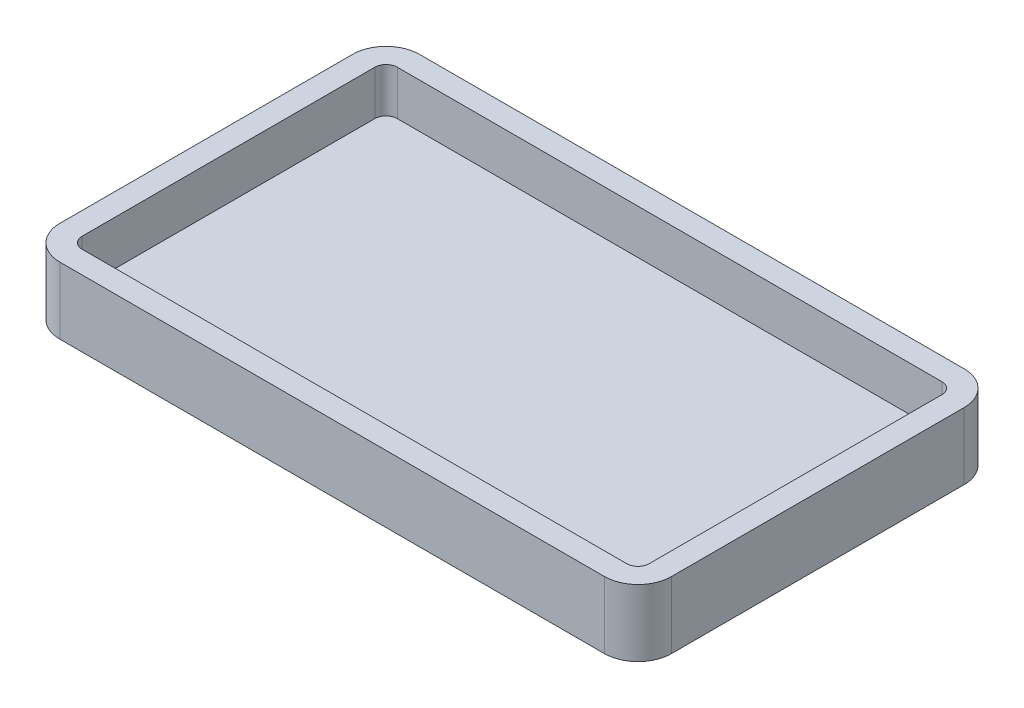
ISO-10303-21;
HEADER;
FILE_DESCRIPTION(('STEP AP214'),'2;1');
FILE_NAME('part.step','',(''),(''),'','','');
FILE_SCHEMA(('AUTOMOTIVE_DESIGN { 1 0 10303 214 1 1 1 1 }'));
ENDSEC;
DATA;
#1=APPLICATION_CONTEXT('core data for automotive mechanical design processes');
#2=APPLICATION_PROTOCOL_DEFINITION('international standard','automotive_design',2000,#1);
#3=PRODUCT_CONTEXT('',#1,'mechanical');
#4=PRODUCT('Part','Part','',(#3));
#5=PRODUCT_RELATED_PRODUCT_CATEGORY('part','',(#4));
#6=PRODUCT_DEFINITION_FORMATION('','',#4);
#7=PRODUCT_DEFINITION_CONTEXT('part definition',#1,'design');
#8=PRODUCT_DEFINITION('design','',#6,#7);
#9=PRODUCT_DEFINITION_SHAPE('','',#8);
#10=(LENGTH_UNIT() NAMED_UNIT(*) SI_UNIT(.MILLI.,.METRE.));
#11=(NAMED_UNIT(*) PLANE_ANGLE_UNIT() SI_UNIT($,.RADIAN.));
#12=(NAMED_UNIT(*) SI_UNIT($,.STERADIAN.) SOLID_ANGLE_UNIT());
#13=UNCERTAINTY_MEASURE_WITH_UNIT(LENGTH_MEASURE(1.E-05),#10,'distance_accuracy_value','');
#14=(GEOMETRIC_REPRESENTATION_CONTEXT(3) GLOBAL_UNCERTAINTY_ASSIGNED_CONTEXT((#13)) GLOBAL_UNIT_ASSIGNED_CONTEXT((#10,
#11,#12)) REPRESENTATION_CONTEXT('',''));
#15=CARTESIAN_POINT('',(0.,0.,0.));
#16=DIRECTION('',(0.,0.,1.));
#17=DIRECTION('',(1.,0.,0.));
#18=AXIS2_PLACEMENT_3D('',#15,#16,#17);
#19=CARTESIAN_POINT('',(4.7752,-9.525,-46.5409330049261));
#20=DIRECTION('',(0.,1.,0.));
#21=DIRECTION('',(0.,0.,1.));
#22=AXIS2_PLACEMENT_3D('',#19,#20,#21);
#23=CYLINDRICAL_SURFACE('',#22,4.7752);
#24=CARTESIAN_POINT('',(4.7752,0.,-46.5409330049261));
#25=DIRECTION('',(0.,1.,0.));
#26=DIRECTION('',(0.,0.,1.));
#27=AXIS2_PLACEMENT_3D('',#24,#25,#26);
#28=CIRCLE('',#27,4.7752);
#29=CARTESIAN_POINT('',(4.77520000000003,0.,-51.3161330049261));
#30=VERTEX_POINT('',#29);
#31=CARTESIAN_POINT('',(0.,0.,-46.5409330049261));
#32=VERTEX_POINT('',#31);
#33=EDGE_CURVE('E141',#30,#32,#28,.T.);
#34=ORIENTED_EDGE('',*,*,#33,.F.);
#35=DIRECTION('',(0.,1.,0.));
#36=VECTOR('',#35,1.);
#37=CARTESIAN_POINT('',(4.77520000000003,-9.525,-51.3161330049261));
#38=LINE('',#37,#36);
#39=CARTESIAN_POINT('',(4.77520000000003,-9.525,-51.3161330049261));
#40=VERTEX_POINT('',#39);
#41=EDGE_CURVE('E11',#40,#30,#38,.T.);
#42=ORIENTED_EDGE('',*,*,#41,.F.);
#43=CARTESIAN_POINT('',(4.7752,-9.525,-46.5409330049261));
#44=DIRECTION('',(0.,1.,0.));
#45=DIRECTION('',(0.,0.,1.));
#46=AXIS2_PLACEMENT_3D('',#43,#44,#45);
#47=CIRCLE('',#46,4.7752);
#48=CARTESIAN_POINT('',(0.,-9.525,-46.5409330049261));
#49=VERTEX_POINT('',#48);
#50=EDGE_CURVE('E162',#40,#49,#47,.T.);
#51=ORIENTED_EDGE('',*,*,#50,.T.);
#52=DIRECTION('',(0.,1.,0.));
#53=VECTOR('',#52,1.);
#54=CARTESIAN_POINT('',(0.,-9.525,-46.5409330049261));
#55=LINE('',#54,#53);
#56=EDGE_CURVE('E34',#49,#32,#55,.T.);
#57=ORIENTED_EDGE('',*,*,#56,.T.);
#58=EDGE_LOOP('',(#34,#42,#51,#57));
#59=FACE_BOUND('',#58,.T.);
#60=ADVANCED_FACE('F31',(#59),#23,.T.);
#61=CARTESIAN_POINT('',(4.77520000000003,-9.525,-51.3161330049261));
#62=DIRECTION('',(0.,0.,-1.));
#63=DIRECTION('',(-1.,0.,0.));
#64=AXIS2_PLACEMENT_3D('',#61,#62,#63);
#65=PLANE('',#64);
#66=DIRECTION('',(-1.,0.,0.));
#67=VECTOR('',#66,1.);
#68=CARTESIAN_POINT('',(4.77520000000003,0.,-51.3161330049261));
#69=LINE('',#68,#67);
#70=CARTESIAN_POINT('',(82.4756698179,0.,-51.3161330049261));
#71=VERTEX_POINT('',#70);
#72=EDGE_CURVE('E160',#71,#30,#69,.T.);
#73=ORIENTED_EDGE('',*,*,#72,.F.);
#74=DIRECTION('',(0.,1.,0.));
#75=VECTOR('',#74,1.);
#76=CARTESIAN_POINT('',(82.4756698179,-9.525,-51.3161330049261));
#77=LINE('',#76,#75);
#78=CARTESIAN_POINT('',(82.4756698179,-9.525,-51.3161330049261));
#79=VERTEX_POINT('',#78);
#80=EDGE_CURVE('E39',#79,#71,#77,.T.);
#81=ORIENTED_EDGE('',*,*,#80,.F.);
#82=DIRECTION('',(-1.,0.,0.));
#83=VECTOR('',#82,1.);
#84=CARTESIAN_POINT('',(4.77520000000003,-9.525,-51.3161330049261));
#85=LINE('',#84,#83);
#86=EDGE_CURVE('E131',#79,#40,#85,.T.);
#87=ORIENTED_EDGE('',*,*,#86,.T.);
#88=ORIENTED_EDGE('',*,*,#41,.T.);
#89=EDGE_LOOP('',(#73,#81,#87,#88));
#90=FACE_BOUND('',#89,.T.);
#91=ADVANCED_FACE('F174',(#90),#65,.T.);
#92=CARTESIAN_POINT('',(82.4756698179,-9.525,-46.5409330049261));
#93=DIRECTION('',(0.,1.,0.));
#94=DIRECTION('',(0.,0.,1.));
#95=AXIS2_PLACEMENT_3D('',#92,#93,#94);
#96=CYLINDRICAL_SURFACE('',#95,4.7752);
#97=CARTESIAN_POINT('',(82.4756698179,0.,-46.5409330049261));
#98=DIRECTION('',(0.,1.,0.));
#99=DIRECTION('',(0.,0.,1.));
#100=AXIS2_PLACEMENT_3D('',#97,#98,#99);
#101=CIRCLE('',#100,4.7752);
#102=CARTESIAN_POINT('',(87.2508698179,0.,-46.5409330049261));
#103=VERTEX_POINT('',#102);
#104=EDGE_CURVE('E118',#103,#71,#101,.T.);
#105=ORIENTED_EDGE('',*,*,#104,.F.);
#106=DIRECTION('',(0.,1.,0.));
#107=VECTOR('',#106,1.);
#108=CARTESIAN_POINT('',(87.2508698179,-9.525,-46.5409330049261));
#109=LINE('',#108,#107);
#110=CARTESIAN_POINT('',(87.2508698179,-9.525,-46.5409330049261));
#111=VERTEX_POINT('',#110);
#112=EDGE_CURVE('E112',#111,#103,#109,.T.);
#113=ORIENTED_EDGE('',*,*,#112,.F.);
#114=CARTESIAN_POINT('',(82.4756698179,-9.525,-46.5409330049261));
#115=DIRECTION('',(0.,1.,0.));
#116=DIRECTION('',(0.,0.,1.));
#117=AXIS2_PLACEMENT_3D('',#114,#115,#116);
#118=CIRCLE('',#117,4.7752);
#119=EDGE_CURVE('E115',#111,#79,#118,.T.);
#120=ORIENTED_EDGE('',*,*,#119,.T.);
#121=ORIENTED_EDGE('',*,*,#80,.T.);
#122=EDGE_LOOP('',(#105,#113,#120,#121));
#123=FACE_BOUND('',#122,.T.);
#124=ADVANCED_FACE('F114',(#123),#96,.T.);
#125=CARTESIAN_POINT('',(87.2508698179,-9.525,-4.77520000000003));
#126=DIRECTION('',(1.,0.,0.));
#127=DIRECTION('',(0.,0.,-1.));
#128=AXIS2_PLACEMENT_3D('',#125,#126,#127);
#129=PLANE('',#128);
#130=DIRECTION('',(0.,0.,-1.));
#131=VECTOR('',#130,1.);
#132=CARTESIAN_POINT('',(87.2508698179,0.,-4.77520000000003));
#133=LINE('',#132,#131);
#134=CARTESIAN_POINT('',(87.2508698179,0.,-4.77520000000003));
#135=VERTEX_POINT('',#134);
#136=EDGE_CURVE('E157',#135,#103,#133,.T.);
#137=ORIENTED_EDGE('',*,*,#136,.F.);
#138=DIRECTION('',(0.,1.,0.));
#139=VECTOR('',#138,1.);
#140=CARTESIAN_POINT('',(87.2508698179,-9.525,-4.77520000000003));
#141=LINE('',#140,#139);
#142=CARTESIAN_POINT('',(87.2508698179,-9.525,-4.77520000000003));
#143=VERTEX_POINT('',#142);
#144=EDGE_CURVE('E123',#143,#135,#141,.T.);
#145=ORIENTED_EDGE('',*,*,#144,.F.);
#146=DIRECTION('',(0.,0.,-1.));
#147=VECTOR('',#146,1.);
#148=CARTESIAN_POINT('',(87.2508698179,-9.525,-4.77520000000003));
#149=LINE('',#148,#147);
#150=EDGE_CURVE('E129',#143,#111,#149,.T.);
#151=ORIENTED_EDGE('',*,*,#150,.T.);
#152=ORIENTED_EDGE('',*,*,#112,.T.);
#153=EDGE_LOOP('',(#137,#145,#151,#152));
#154=FACE_BOUND('',#153,.T.);
#155=ADVANCED_FACE('F133',(#154),#129,.T.);
#156=CARTESIAN_POINT('',(82.4756698179,-9.525,-4.7752));
#157=DIRECTION('',(0.,1.,0.));
#158=DIRECTION('',(0.,0.,1.));
#159=AXIS2_PLACEMENT_3D('',#156,#157,#158);
#160=CYLINDRICAL_SURFACE('',#159,4.7752);
#161=CARTESIAN_POINT('',(82.4756698179,0.,-4.7752));
#162=DIRECTION('',(0.,1.,0.));
#163=DIRECTION('',(0.,0.,-1.));
#164=AXIS2_PLACEMENT_3D('',#161,#162,#163);
#165=CIRCLE('',#164,4.7752);
#166=CARTESIAN_POINT('',(82.4756698179,0.,0.));
#167=VERTEX_POINT('',#166);
#168=EDGE_CURVE('E154',#167,#135,#165,.T.);
#169=ORIENTED_EDGE('',*,*,#168,.F.);
#170=DIRECTION('',(0.,1.,0.));
#171=VECTOR('',#170,1.);
#172=CARTESIAN_POINT('',(82.4756698179,-9.525,0.));
#173=LINE('',#172,#171);
#174=CARTESIAN_POINT('',(82.4756698179,-9.525,0.));
#175=VERTEX_POINT('',#174);
#176=EDGE_CURVE('E166',#175,#167,#173,.T.);
#177=ORIENTED_EDGE('',*,*,#176,.F.);
#178=CARTESIAN_POINT('',(82.4756698179,-9.525,-4.7752));
#179=DIRECTION('',(0.,1.,0.));
#180=DIRECTION('',(0.,0.,-1.));
#181=AXIS2_PLACEMENT_3D('',#178,#179,#180);
#182=CIRCLE('',#181,4.7752);
#183=EDGE_CURVE('E134',#175,#143,#182,.T.);
#184=ORIENTED_EDGE('',*,*,#183,.T.);
#185=ORIENTED_EDGE('',*,*,#144,.T.);
#186=EDGE_LOOP('',(#169,#177,#184,#185));
#187=FACE_BOUND('',#186,.T.);
#188=ADVANCED_FACE('F187',(#187),#160,.T.);
#189=CARTESIAN_POINT('',(4.77520000000003,-9.525,0.));
#190=DIRECTION('',(0.,0.,1.));
#191=DIRECTION('',(1.,0.,0.));
#192=AXIS2_PLACEMENT_3D('',#189,#190,#191);
#193=PLANE('',#192);
#194=DIRECTION('',(1.,0.,0.));
#195=VECTOR('',#194,1.);
#196=CARTESIAN_POINT('',(4.77520000000003,0.,0.));
#197=LINE('',#196,#195);
#198=CARTESIAN_POINT('',(4.77520000000003,0.,0.));
#199=VERTEX_POINT('',#198);
#200=EDGE_CURVE('E151',#199,#167,#197,.T.);
#201=ORIENTED_EDGE('',*,*,#200,.F.);
#202=DIRECTION('',(0.,1.,0.));
#203=VECTOR('',#202,1.);
#204=CARTESIAN_POINT('',(4.77520000000003,-9.525,0.));
#205=LINE('',#204,#203);
#206=CARTESIAN_POINT('',(4.77520000000003,-9.525,0.));
#207=VERTEX_POINT('',#206);
#208=EDGE_CURVE('E168',#207,#199,#205,.T.);
#209=ORIENTED_EDGE('',*,*,#208,.F.);
#210=DIRECTION('',(1.,0.,0.));
#211=VECTOR('',#210,1.);
#212=CARTESIAN_POINT('',(4.77520000000003,-9.525,0.));
#213=LINE('',#212,#211);
#214=EDGE_CURVE('E136',#207,#175,#213,.T.);
#215=ORIENTED_EDGE('',*,*,#214,.T.);
#216=ORIENTED_EDGE('',*,*,#176,.T.);
#217=EDGE_LOOP('',(#201,#209,#215,#216));
#218=FACE_BOUND('',#217,.T.);
#219=ADVANCED_FACE('F190',(#218),#193,.T.);
#220=CARTESIAN_POINT('',(4.7752,-9.525,-4.7752));
#221=DIRECTION('',(0.,1.,0.));
#222=DIRECTION('',(0.,0.,1.));
#223=AXIS2_PLACEMENT_3D('',#220,#221,#222);
#224=CYLINDRICAL_SURFACE('',#223,4.7752);
#225=CARTESIAN_POINT('',(4.7752,0.,-4.7752));
#226=DIRECTION('',(0.,1.,0.));
#227=DIRECTION('',(0.,0.,1.));
#228=AXIS2_PLACEMENT_3D('',#225,#226,#227);
#229=CIRCLE('',#228,4.7752);
#230=CARTESIAN_POINT('',(0.,0.,-4.77520000000003));
#231=VERTEX_POINT('',#230);
#232=EDGE_CURVE('E148',#231,#199,#229,.T.);
#233=ORIENTED_EDGE('',*,*,#232,.F.);
#234=DIRECTION('',(0.,1.,0.));
#235=VECTOR('',#234,1.);
#236=CARTESIAN_POINT('',(0.,-9.525,-4.77520000000003));
#237=LINE('',#236,#235);
#238=CARTESIAN_POINT('',(0.,-9.525,-4.77520000000003));
#239=VERTEX_POINT('',#238);
#240=EDGE_CURVE('E169',#239,#231,#237,.T.);
#241=ORIENTED_EDGE('',*,*,#240,.F.);
#242=CARTESIAN_POINT('',(4.7752,-9.525,-4.7752));
#243=DIRECTION('',(0.,1.,0.));
#244=DIRECTION('',(0.,0.,1.));
#245=AXIS2_PLACEMENT_3D('',#242,#243,#244);
#246=CIRCLE('',#245,4.7752);
#247=EDGE_CURVE('E320',#239,#207,#246,.T.);
#248=ORIENTED_EDGE('',*,*,#247,.T.);
#249=ORIENTED_EDGE('',*,*,#208,.T.);
#250=EDGE_LOOP('',(#233,#241,#248,#249));
#251=FACE_BOUND('',#250,.T.);
#252=ADVANCED_FACE('F194',(#251),#224,.T.);
#253=CARTESIAN_POINT('',(0.,-9.525,-4.77520000000003));
#254=DIRECTION('',(-1.,0.,0.));
#255=DIRECTION('',(0.,0.,1.));
#256=AXIS2_PLACEMENT_3D('',#253,#254,#255);
#257=PLANE('',#256);
#258=DIRECTION('',(0.,0.,1.));
#259=VECTOR('',#258,1.);
#260=CARTESIAN_POINT('',(0.,0.,-4.77520000000003));
#261=LINE('',#260,#259);
#262=EDGE_CURVE('E144',#32,#231,#261,.T.);
#263=ORIENTED_EDGE('',*,*,#262,.F.);
#264=ORIENTED_EDGE('',*,*,#56,.F.);
#265=DIRECTION('',(0.,0.,1.));
#266=VECTOR('',#265,1.);
#267=CARTESIAN_POINT('',(0.,-9.525,-4.77520000000003));
#268=LINE('',#267,#266);
#269=EDGE_CURVE('E318',#49,#239,#268,.T.);
#270=ORIENTED_EDGE('',*,*,#269,.T.);
#271=ORIENTED_EDGE('',*,*,#240,.T.);
#272=EDGE_LOOP('',(#263,#264,#270,#271));
#273=FACE_BOUND('',#272,.T.);
#274=ADVANCED_FACE('F171',(#273),#257,.T.);
#275=CARTESIAN_POINT('',(4.7752,-9.525,-46.5409330049261));
#276=DIRECTION('',(0.,1.,0.));
#277=DIRECTION('',(0.,0.,1.));
#278=AXIS2_PLACEMENT_3D('',#275,#276,#277);
#279=PLANE('',#278);
#280=ORIENTED_EDGE('',*,*,#50,.F.);
#281=ORIENTED_EDGE('',*,*,#86,.F.);
#282=ORIENTED_EDGE('',*,*,#119,.F.);
#283=ORIENTED_EDGE('',*,*,#150,.F.);
#284=ORIENTED_EDGE('',*,*,#183,.F.);
#285=ORIENTED_EDGE('',*,*,#214,.F.);
#286=ORIENTED_EDGE('',*,*,#247,.F.);
#287=ORIENTED_EDGE('',*,*,#269,.F.);
#288=EDGE_LOOP('',(#280,#281,#282,#283,#284,#285,#286,#287));
#289=FACE_BOUND('',#288,.T.);
#290=ADVANCED_FACE('F127',(#289),#279,.F.);
#291=CARTESIAN_POINT('',(4.7752,0.,-46.5409330049261));
#292=DIRECTION('',(0.,1.,0.));
#293=DIRECTION('',(0.,0.,1.));
#294=AXIS2_PLACEMENT_3D('',#291,#292,#293);
#295=PLANE('',#294);
#296=CARTESIAN_POINT('',(4.7752,0.,-46.5409330049261));
#297=DIRECTION('',(0.,1.,0.));
#298=DIRECTION('',(0.,0.,1.));
#299=AXIS2_PLACEMENT_3D('',#296,#297,#298);
#300=CIRCLE('',#299,1.6002);
#301=CARTESIAN_POINT('',(4.77520000000004,0.,-48.1411330049261));
#302=VERTEX_POINT('',#301);
#303=CARTESIAN_POINT('',(3.175,0.,-46.5409330049261));
#304=VERTEX_POINT('',#303);
#305=EDGE_CURVE('E47',#302,#304,#300,.T.);
#306=ORIENTED_EDGE('',*,*,#305,.F.);
#307=DIRECTION('',(-1.,0.,0.));
#308=VECTOR('',#307,1.);
#309=CARTESIAN_POINT('',(82.4756698179,0.,-48.1411330049261));
#310=LINE('',#309,#308);
#311=CARTESIAN_POINT('',(82.4756698179,0.,-48.1411330049261));
#312=VERTEX_POINT('',#311);
#313=EDGE_CURVE('E257',#312,#302,#310,.T.);
#314=ORIENTED_EDGE('',*,*,#313,.F.);
#315=CARTESIAN_POINT('',(82.4756698179,0.,-46.5409330049261));
#316=DIRECTION('',(0.,1.,0.));
#317=DIRECTION('',(0.,0.,1.));
#318=AXIS2_PLACEMENT_3D('',#315,#316,#317);
#319=CIRCLE('',#318,1.60020000000001);
#320=CARTESIAN_POINT('',(84.0758698179,0.,-46.5409330049261));
#321=VERTEX_POINT('',#320);
#322=EDGE_CURVE('E262',#321,#312,#319,.T.);
#323=ORIENTED_EDGE('',*,*,#322,.F.);
#324=DIRECTION('',(0.,0.,-1.));
#325=VECTOR('',#324,1.);
#326=CARTESIAN_POINT('',(84.0758698179,0.,-4.77520000000001));
#327=LINE('',#326,#325);
#328=CARTESIAN_POINT('',(84.0758698179,0.,-4.77520000000001));
#329=VERTEX_POINT('',#328);
#330=EDGE_CURVE('E292',#329,#321,#327,.T.);
#331=ORIENTED_EDGE('',*,*,#330,.F.);
#332=CARTESIAN_POINT('',(82.4756698179,0.,-4.7752));
#333=DIRECTION('',(0.,1.,0.));
#334=DIRECTION('',(0.,0.,1.));
#335=AXIS2_PLACEMENT_3D('',#332,#333,#334);
#336=CIRCLE('',#335,1.6002);
#337=CARTESIAN_POINT('',(82.4756698179,0.,-3.175));
#338=VERTEX_POINT('',#337);
#339=EDGE_CURVE('E289',#338,#329,#336,.T.);
#340=ORIENTED_EDGE('',*,*,#339,.F.);
#341=DIRECTION('',(1.,0.,0.));
#342=VECTOR('',#341,1.);
#343=CARTESIAN_POINT('',(4.77520000000001,0.,-3.175));
#344=LINE('',#343,#342);
#345=CARTESIAN_POINT('',(4.77520000000001,0.,-3.175));
#346=VERTEX_POINT('',#345);
#347=EDGE_CURVE('E286',#346,#338,#344,.T.);
#348=ORIENTED_EDGE('',*,*,#347,.F.);
#349=CARTESIAN_POINT('',(4.7752,0.,-4.7752));
#350=DIRECTION('',(0.,1.,0.));
#351=DIRECTION('',(0.,0.,1.));
#352=AXIS2_PLACEMENT_3D('',#349,#350,#351);
#353=CIRCLE('',#352,1.6002);
#354=CARTESIAN_POINT('',(3.175,0.,-4.77520000000004));
#355=VERTEX_POINT('',#354);
#356=EDGE_CURVE('E283',#355,#346,#353,.T.);
#357=ORIENTED_EDGE('',*,*,#356,.F.);
#358=DIRECTION('',(0.,0.,1.));
#359=VECTOR('',#358,1.);
#360=CARTESIAN_POINT('',(3.175,0.,-46.5409330049261));
#361=LINE('',#360,#359);
#362=EDGE_CURVE('E280',#304,#355,#361,.T.);
#363=ORIENTED_EDGE('',*,*,#362,.F.);
#364=EDGE_LOOP('',(#306,#314,#323,#331,#340,#348,#357,#363));
#365=FACE_BOUND('',#364,.T.);
#366=ORIENTED_EDGE('',*,*,#33,.T.);
#367=ORIENTED_EDGE('',*,*,#262,.T.);
#368=ORIENTED_EDGE('',*,*,#232,.T.);
#369=ORIENTED_EDGE('',*,*,#200,.T.);
#370=ORIENTED_EDGE('',*,*,#168,.T.);
#371=ORIENTED_EDGE('',*,*,#136,.T.);
#372=ORIENTED_EDGE('',*,*,#104,.T.);
#373=ORIENTED_EDGE('',*,*,#72,.T.);
#374=EDGE_LOOP('',(#366,#367,#368,#369,#370,#371,#372,#373));
#375=FACE_BOUND('',#374,.T.);
#376=ADVANCED_FACE('F173',(#365,#375),#295,.T.);
#377=CARTESIAN_POINT('',(4.7752,-6.35,-46.5409330049261));
#378=DIRECTION('',(0.,1.,0.));
#379=DIRECTION('',(0.,0.,1.));
#380=AXIS2_PLACEMENT_3D('',#377,#378,#379);
#381=CYLINDRICAL_SURFACE('',#380,1.6002);
#382=ORIENTED_EDGE('',*,*,#305,.T.);
#383=DIRECTION('',(0.,1.,0.));
#384=VECTOR('',#383,1.);
#385=CARTESIAN_POINT('',(3.175,-6.35,-46.5409330049261));
#386=LINE('',#385,#384);
#387=CARTESIAN_POINT('',(3.175,-6.35,-46.5409330049261));
#388=VERTEX_POINT('',#387);
#389=EDGE_CURVE('E278',#388,#304,#386,.T.);
#390=ORIENTED_EDGE('',*,*,#389,.F.);
#391=CARTESIAN_POINT('',(4.7752,-6.35,-46.5409330049261));
#392=DIRECTION('',(0.,1.,0.));
#393=DIRECTION('',(0.,0.,1.));
#394=AXIS2_PLACEMENT_3D('',#391,#392,#393);
#395=CIRCLE('',#394,1.6002);
#396=CARTESIAN_POINT('',(4.77520000000004,-6.35,-48.1411330049261));
#397=VERTEX_POINT('',#396);
#398=EDGE_CURVE('E248',#397,#388,#395,.T.);
#399=ORIENTED_EDGE('',*,*,#398,.F.);
#400=DIRECTION('',(0.,1.,0.));
#401=VECTOR('',#400,1.);
#402=CARTESIAN_POINT('',(4.77520000000004,-6.35,-48.1411330049261));
#403=LINE('',#402,#401);
#404=EDGE_CURVE('E145',#397,#302,#403,.T.);
#405=ORIENTED_EDGE('',*,*,#404,.T.);
#406=EDGE_LOOP('',(#382,#390,#399,#405));
#407=FACE_BOUND('',#406,.T.);
#408=ADVANCED_FACE('F205',(#407),#381,.F.);
#409=CARTESIAN_POINT('',(82.4756698179,-6.35,-48.1411330049261));
#410=DIRECTION('',(0.,0.,-1.));
#411=DIRECTION('',(-1.,0.,0.));
#412=AXIS2_PLACEMENT_3D('',#409,#410,#411);
#413=PLANE('',#412);
#414=ORIENTED_EDGE('',*,*,#313,.T.);
#415=ORIENTED_EDGE('',*,*,#404,.F.);
#416=DIRECTION('',(-1.,0.,0.));
#417=VECTOR('',#416,1.);
#418=CARTESIAN_POINT('',(82.4756698179,-6.35,-48.1411330049261));
#419=LINE('',#418,#417);
#420=CARTESIAN_POINT('',(82.4756698179,-6.35,-48.1411330049261));
#421=VERTEX_POINT('',#420);
#422=EDGE_CURVE('E255',#421,#397,#419,.T.);
#423=ORIENTED_EDGE('',*,*,#422,.F.);
#424=DIRECTION('',(0.,1.,0.));
#425=VECTOR('',#424,1.);
#426=CARTESIAN_POINT('',(82.4756698179,-6.35,-48.1411330049261));
#427=LINE('',#426,#425);
#428=EDGE_CURVE('E298',#421,#312,#427,.T.);
#429=ORIENTED_EDGE('',*,*,#428,.T.);
#430=EDGE_LOOP('',(#414,#415,#423,#429));
#431=FACE_BOUND('',#430,.T.);
#432=ADVANCED_FACE('F210',(#431),#413,.F.);
#433=CARTESIAN_POINT('',(82.4756698179,-6.35,-46.5409330049261));
#434=DIRECTION('',(0.,1.,0.));
#435=DIRECTION('',(0.,0.,1.));
#436=AXIS2_PLACEMENT_3D('',#433,#434,#435);
#437=CYLINDRICAL_SURFACE('',#436,1.60020000000001);
#438=ORIENTED_EDGE('',*,*,#322,.T.);
#439=ORIENTED_EDGE('',*,*,#428,.F.);
#440=CARTESIAN_POINT('',(82.4756698179,-6.35,-46.5409330049261));
#441=DIRECTION('',(0.,1.,0.));
#442=DIRECTION('',(0.,0.,1.));
#443=AXIS2_PLACEMENT_3D('',#440,#441,#442);
#444=CIRCLE('',#443,1.60020000000001);
#445=CARTESIAN_POINT('',(84.0758698179,-6.35,-46.5409330049261));
#446=VERTEX_POINT('',#445);
#447=EDGE_CURVE('E275',#446,#421,#444,.T.);
#448=ORIENTED_EDGE('',*,*,#447,.F.);
#449=DIRECTION('',(0.,1.,0.));
#450=VECTOR('',#449,1.);
#451=CARTESIAN_POINT('',(84.0758698179,-6.35,-46.5409330049261));
#452=LINE('',#451,#450);
#453=EDGE_CURVE('E301',#446,#321,#452,.T.);
#454=ORIENTED_EDGE('',*,*,#453,.T.);
#455=EDGE_LOOP('',(#438,#439,#448,#454));
#456=FACE_BOUND('',#455,.T.);
#457=ADVANCED_FACE('F231',(#456),#437,.F.);
#458=CARTESIAN_POINT('',(84.0758698179,-6.35,-4.77520000000001));
#459=DIRECTION('',(1.,0.,0.));
#460=DIRECTION('',(0.,0.,-1.));
#461=AXIS2_PLACEMENT_3D('',#458,#459,#460);
#462=PLANE('',#461);
#463=ORIENTED_EDGE('',*,*,#330,.T.);
#464=ORIENTED_EDGE('',*,*,#453,.F.);
#465=DIRECTION('',(0.,0.,-1.));
#466=VECTOR('',#465,1.);
#467=CARTESIAN_POINT('',(84.0758698179,-6.35,-4.77520000000001));
#468=LINE('',#467,#466);
#469=CARTESIAN_POINT('',(84.0758698179,-6.35,-4.77520000000001));
#470=VERTEX_POINT('',#469);
#471=EDGE_CURVE('E272',#470,#446,#468,.T.);
#472=ORIENTED_EDGE('',*,*,#471,.F.);
#473=DIRECTION('',(0.,1.,0.));
#474=VECTOR('',#473,1.);
#475=CARTESIAN_POINT('',(84.0758698179,-6.35,-4.77520000000001));
#476=LINE('',#475,#474);
#477=EDGE_CURVE('E304',#470,#329,#476,.T.);
#478=ORIENTED_EDGE('',*,*,#477,.T.);
#479=EDGE_LOOP('',(#463,#464,#472,#478));
#480=FACE_BOUND('',#479,.T.);
#481=ADVANCED_FACE('F227',(#480),#462,.F.);
#482=CARTESIAN_POINT('',(82.4756698179,-6.35,-4.7752));
#483=DIRECTION('',(0.,1.,0.));
#484=DIRECTION('',(0.,0.,1.));
#485=AXIS2_PLACEMENT_3D('',#482,#483,#484);
#486=CYLINDRICAL_SURFACE('',#485,1.6002);
#487=ORIENTED_EDGE('',*,*,#339,.T.);
#488=ORIENTED_EDGE('',*,*,#477,.F.);
#489=CARTESIAN_POINT('',(82.4756698179,-6.35,-4.7752));
#490=DIRECTION('',(0.,1.,0.));
#491=DIRECTION('',(0.,0.,1.));
#492=AXIS2_PLACEMENT_3D('',#489,#490,#491);
#493=CIRCLE('',#492,1.6002);
#494=CARTESIAN_POINT('',(82.4756698179,-6.35,-3.175));
#495=VERTEX_POINT('',#494);
#496=EDGE_CURVE('E269',#495,#470,#493,.T.);
#497=ORIENTED_EDGE('',*,*,#496,.F.);
#498=DIRECTION('',(0.,1.,0.));
#499=VECTOR('',#498,1.);
#500=CARTESIAN_POINT('',(82.4756698179,-6.35,-3.175));
#501=LINE('',#500,#499);
#502=EDGE_CURVE('E307',#495,#338,#501,.T.);
#503=ORIENTED_EDGE('',*,*,#502,.T.);
#504=EDGE_LOOP('',(#487,#488,#497,#503));
#505=FACE_BOUND('',#504,.T.);
#506=ADVANCED_FACE('F223',(#505),#486,.F.);
#507=CARTESIAN_POINT('',(4.77520000000001,-6.35,-3.175));
#508=DIRECTION('',(0.,0.,1.));
#509=DIRECTION('',(1.,0.,0.));
#510=AXIS2_PLACEMENT_3D('',#507,#508,#509);
#511=PLANE('',#510);
#512=ORIENTED_EDGE('',*,*,#347,.T.);
#513=ORIENTED_EDGE('',*,*,#502,.F.);
#514=DIRECTION('',(1.,0.,0.));
#515=VECTOR('',#514,1.);
#516=CARTESIAN_POINT('',(4.77520000000001,-6.35,-3.175));
#517=LINE('',#516,#515);
#518=CARTESIAN_POINT('',(4.77520000000001,-6.35,-3.175));
#519=VERTEX_POINT('',#518);
#520=EDGE_CURVE('E266',#519,#495,#517,.T.);
#521=ORIENTED_EDGE('',*,*,#520,.F.);
#522=DIRECTION('',(0.,1.,0.));
#523=VECTOR('',#522,1.);
#524=CARTESIAN_POINT('',(4.77520000000001,-6.35,-3.175));
#525=LINE('',#524,#523);
#526=EDGE_CURVE('E310',#519,#346,#525,.T.);
#527=ORIENTED_EDGE('',*,*,#526,.T.);
#528=EDGE_LOOP('',(#512,#513,#521,#527));
#529=FACE_BOUND('',#528,.T.);
#530=ADVANCED_FACE('F219',(#529),#511,.F.);
#531=CARTESIAN_POINT('',(4.7752,-6.35,-4.7752));
#532=DIRECTION('',(0.,1.,0.));
#533=DIRECTION('',(0.,0.,1.));
#534=AXIS2_PLACEMENT_3D('',#531,#532,#533);
#535=CYLINDRICAL_SURFACE('',#534,1.6002);
#536=ORIENTED_EDGE('',*,*,#356,.T.);
#537=ORIENTED_EDGE('',*,*,#526,.F.);
#538=CARTESIAN_POINT('',(4.7752,-6.35,-4.7752));
#539=DIRECTION('',(0.,1.,0.));
#540=DIRECTION('',(0.,0.,1.));
#541=AXIS2_PLACEMENT_3D('',#538,#539,#540);
#542=CIRCLE('',#541,1.6002);
#543=CARTESIAN_POINT('',(3.175,-6.35,-4.77520000000004));
#544=VERTEX_POINT('',#543);
#545=EDGE_CURVE('E259',#544,#519,#542,.T.);
#546=ORIENTED_EDGE('',*,*,#545,.F.);
#547=DIRECTION('',(0.,1.,0.));
#548=VECTOR('',#547,1.);
#549=CARTESIAN_POINT('',(3.175,-6.35,-4.77520000000004));
#550=LINE('',#549,#548);
#551=EDGE_CURVE('E313',#544,#355,#550,.T.);
#552=ORIENTED_EDGE('',*,*,#551,.T.);
#553=EDGE_LOOP('',(#536,#537,#546,#552));
#554=FACE_BOUND('',#553,.T.);
#555=ADVANCED_FACE('F215',(#554),#535,.F.);
#556=CARTESIAN_POINT('',(3.175,-6.35,-46.5409330049261));
#557=DIRECTION('',(-1.,0.,0.));
#558=DIRECTION('',(0.,0.,1.));
#559=AXIS2_PLACEMENT_3D('',#556,#557,#558);
#560=PLANE('',#559);
#561=ORIENTED_EDGE('',*,*,#362,.T.);
#562=ORIENTED_EDGE('',*,*,#551,.F.);
#563=DIRECTION('',(0.,0.,1.));
#564=VECTOR('',#563,1.);
#565=CARTESIAN_POINT('',(3.175,-6.35,-46.5409330049261));
#566=LINE('',#565,#564);
#567=EDGE_CURVE('E252',#388,#544,#566,.T.);
#568=ORIENTED_EDGE('',*,*,#567,.F.);
#569=ORIENTED_EDGE('',*,*,#389,.T.);
#570=EDGE_LOOP('',(#561,#562,#568,#569));
#571=FACE_BOUND('',#570,.T.);
#572=ADVANCED_FACE('F211',(#571),#560,.F.);
#573=CARTESIAN_POINT('',(4.7752,-6.35,-46.5409330049261));
#574=DIRECTION('',(0.,1.,0.));
#575=DIRECTION('',(0.,0.,1.));
#576=AXIS2_PLACEMENT_3D('',#573,#574,#575);
#577=PLANE('',#576);
#578=ORIENTED_EDGE('',*,*,#398,.T.);
#579=ORIENTED_EDGE('',*,*,#567,.T.);
#580=ORIENTED_EDGE('',*,*,#545,.T.);
#581=ORIENTED_EDGE('',*,*,#520,.T.);
#582=ORIENTED_EDGE('',*,*,#496,.T.);
#583=ORIENTED_EDGE('',*,*,#471,.T.);
#584=ORIENTED_EDGE('',*,*,#447,.T.);
#585=ORIENTED_EDGE('',*,*,#422,.T.);
#586=EDGE_LOOP('',(#578,#579,#580,#581,#582,#583,#584,#585));
#587=FACE_BOUND('',#586,.T.);
#588=ADVANCED_FACE('F214',(#587),#577,.T.);
#589=CLOSED_SHELL('',(#60,#91,#124,#155,#188,#219,#252,#274,#290,#376,#408,#432,#457,#481,#506,
#530,#555,#572,#588));
#590=MANIFOLD_SOLID_BREP('B2',#589);
#591=ADVANCED_BREP_SHAPE_REPRESENTATION('',(#18,#590),#14);
#592=SHAPE_DEFINITION_REPRESENTATION(#9,#591);
ENDSEC;
END-ISO-10303-21;
